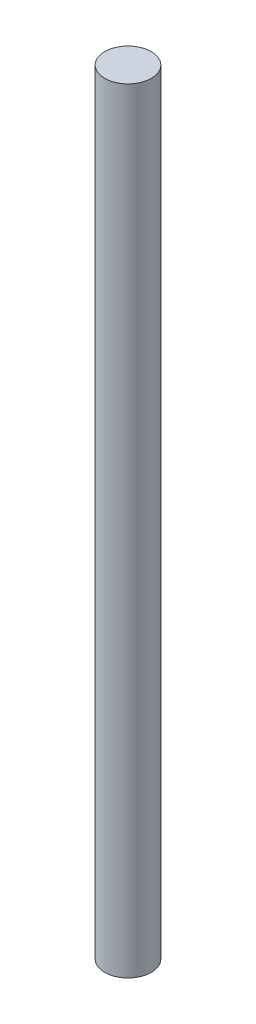
ISO-10303-21;
HEADER;
FILE_DESCRIPTION(('STEP AP214'),'2;1');
FILE_NAME('part.step','',(''),(''),'','','');
FILE_SCHEMA(('AUTOMOTIVE_DESIGN { 1 0 10303 214 1 1 1 1 }'));
ENDSEC;
DATA;
#1=APPLICATION_CONTEXT('core data for automotive mechanical design processes');
#2=APPLICATION_PROTOCOL_DEFINITION('international standard','automotive_design',2000,#1);
#3=PRODUCT_CONTEXT('',#1,'mechanical');
#4=PRODUCT('Part','Part','',(#3));
#5=PRODUCT_RELATED_PRODUCT_CATEGORY('part','',(#4));
#6=PRODUCT_DEFINITION_FORMATION('','',#4);
#7=PRODUCT_DEFINITION_CONTEXT('part definition',#1,'design');
#8=PRODUCT_DEFINITION('design','',#6,#7);
#9=PRODUCT_DEFINITION_SHAPE('','',#8);
#10=(LENGTH_UNIT() NAMED_UNIT(*) SI_UNIT(.MILLI.,.METRE.));
#11=(NAMED_UNIT(*) PLANE_ANGLE_UNIT() SI_UNIT($,.RADIAN.));
#12=(NAMED_UNIT(*) SI_UNIT($,.STERADIAN.) SOLID_ANGLE_UNIT());
#13=UNCERTAINTY_MEASURE_WITH_UNIT(LENGTH_MEASURE(1.E-05),#10,'distance_accuracy_value','');
#14=(GEOMETRIC_REPRESENTATION_CONTEXT(3) GLOBAL_UNCERTAINTY_ASSIGNED_CONTEXT((#13)) GLOBAL_UNIT_ASSIGNED_CONTEXT((#10,
#11,#12)) REPRESENTATION_CONTEXT('',''));
#15=CARTESIAN_POINT('',(0.,0.,0.));
#16=DIRECTION('',(0.,0.,1.));
#17=DIRECTION('',(1.,0.,0.));
#18=AXIS2_PLACEMENT_3D('',#15,#16,#17);
#19=CARTESIAN_POINT('',(0.,150000.,0.));
#20=DIRECTION('',(0.,-1.,0.));
#21=DIRECTION('',(0.,0.,-1.));
#22=AXIS2_PLACEMENT_3D('',#19,#20,#21);
#23=CYLINDRICAL_SURFACE('',#22,4500.);
#24=CARTESIAN_POINT('',(0.,150000.,0.));
#25=DIRECTION('',(0.,1.,0.));
#26=DIRECTION('',(0.,0.,1.));
#27=AXIS2_PLACEMENT_3D('',#24,#25,#26);
#28=CIRCLE('',#27,4500.);
#29=CARTESIAN_POINT('',(0.,150000.,4500.));
#30=VERTEX_POINT('',#29);
#31=EDGE_CURVE('E10',#30,#30,#28,.T.);
#32=ORIENTED_EDGE('',*,*,#31,.F.);
#33=EDGE_LOOP('',(#32));
#34=FACE_BOUND('',#33,.T.);
#35=CARTESIAN_POINT('',(0.,0.,0.));
#36=DIRECTION('',(0.,1.,0.));
#37=DIRECTION('',(0.,0.,1.));
#38=AXIS2_PLACEMENT_3D('',#35,#36,#37);
#39=CIRCLE('',#38,4500.);
#40=CARTESIAN_POINT('',(0.,0.,4500.));
#41=VERTEX_POINT('',#40);
#42=EDGE_CURVE('E37',#41,#41,#39,.T.);
#43=ORIENTED_EDGE('',*,*,#42,.T.);
#44=EDGE_LOOP('',(#43));
#45=FACE_BOUND('',#44,.T.);
#46=ADVANCED_FACE('F40',(#34,#45),#23,.T.);
#47=CARTESIAN_POINT('',(0.,150000.,0.));
#48=DIRECTION('',(0.,1.,0.));
#49=DIRECTION('',(0.,0.,1.));
#50=AXIS2_PLACEMENT_3D('',#47,#48,#49);
#51=PLANE('',#50);
#52=ORIENTED_EDGE('',*,*,#31,.T.);
#53=EDGE_LOOP('',(#52));
#54=FACE_BOUND('',#53,.T.);
#55=ADVANCED_FACE('F55',(#54),#51,.T.);
#56=CARTESIAN_POINT('',(0.,0.,0.));
#57=DIRECTION('',(0.,1.,0.));
#58=DIRECTION('',(0.,0.,1.));
#59=AXIS2_PLACEMENT_3D('',#56,#57,#58);
#60=PLANE('',#59);
#61=ORIENTED_EDGE('',*,*,#42,.F.);
#62=EDGE_LOOP('',(#61));
#63=FACE_BOUND('',#62,.T.);
#64=ADVANCED_FACE('F49',(#63),#60,.F.);
#65=CLOSED_SHELL('',(#46,#55,#64));
#66=MANIFOLD_SOLID_BREP('B2',#65);
#67=ADVANCED_BREP_SHAPE_REPRESENTATION('',(#18,#66),#14);
#68=SHAPE_DEFINITION_REPRESENTATION(#9,#67);
ENDSEC;
END-ISO-10303-21;
